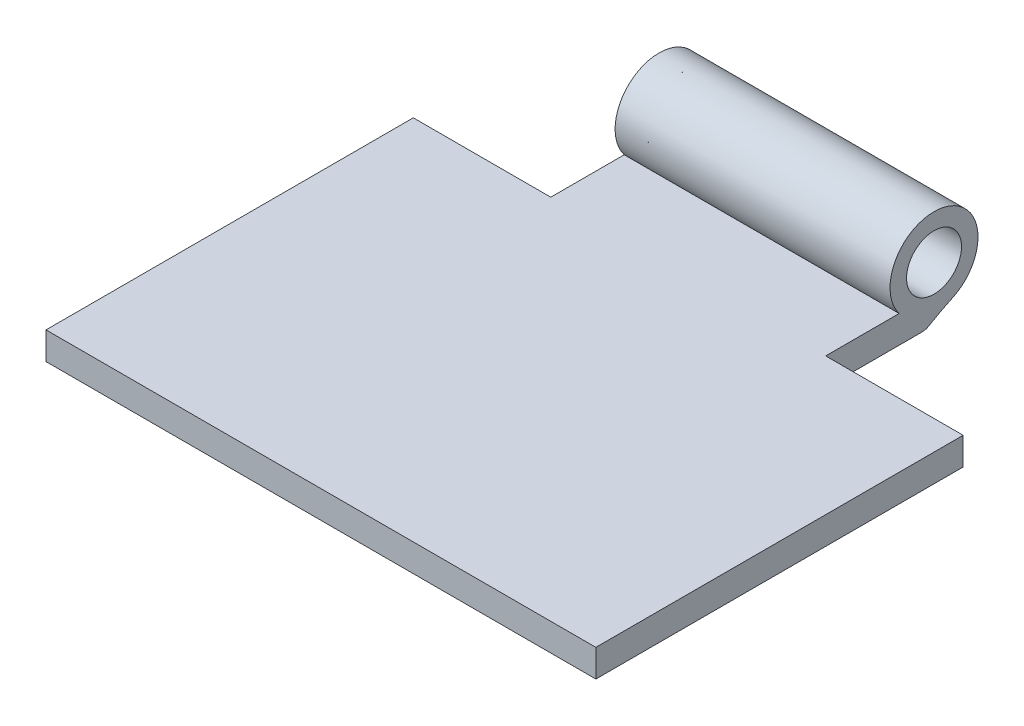
ISO-10303-21;
HEADER;
FILE_DESCRIPTION(('STEP AP214'),'2;1');
FILE_NAME('part.step','',(''),(''),'','','');
FILE_SCHEMA(('AUTOMOTIVE_DESIGN { 1 0 10303 214 1 1 1 1 }'));
ENDSEC;
DATA;
#1=APPLICATION_CONTEXT('core data for automotive mechanical design processes');
#2=APPLICATION_PROTOCOL_DEFINITION('international standard','automotive_design',2000,#1);
#3=PRODUCT_CONTEXT('',#1,'mechanical');
#4=PRODUCT('Part','Part','',(#3));
#5=PRODUCT_RELATED_PRODUCT_CATEGORY('part','',(#4));
#6=PRODUCT_DEFINITION_FORMATION('','',#4);
#7=PRODUCT_DEFINITION_CONTEXT('part definition',#1,'design');
#8=PRODUCT_DEFINITION('design','',#6,#7);
#9=PRODUCT_DEFINITION_SHAPE('','',#8);
#10=(LENGTH_UNIT() NAMED_UNIT(*) SI_UNIT(.MILLI.,.METRE.));
#11=(NAMED_UNIT(*) PLANE_ANGLE_UNIT() SI_UNIT($,.RADIAN.));
#12=(NAMED_UNIT(*) SI_UNIT($,.STERADIAN.) SOLID_ANGLE_UNIT());
#13=UNCERTAINTY_MEASURE_WITH_UNIT(LENGTH_MEASURE(1.E-05),#10,'distance_accuracy_value','');
#14=(GEOMETRIC_REPRESENTATION_CONTEXT(3) GLOBAL_UNCERTAINTY_ASSIGNED_CONTEXT((#13)) GLOBAL_UNIT_ASSIGNED_CONTEXT((#10,
#11,#12)) REPRESENTATION_CONTEXT('',''));
#15=CARTESIAN_POINT('',(0.,0.,0.));
#16=DIRECTION('',(0.,0.,1.));
#17=DIRECTION('',(1.,0.,0.));
#18=AXIS2_PLACEMENT_3D('',#15,#16,#17);
#19=CARTESIAN_POINT('',(0.,1.,0.));
#20=DIRECTION('',(0.,1.,0.));
#21=DIRECTION('',(0.,0.,1.));
#22=AXIS2_PLACEMENT_3D('',#19,#20,#21);
#23=PLANE('',#22);
#24=DIRECTION('',(0.,0.,1.));
#25=VECTOR('',#24,1.);
#26=CARTESIAN_POINT('',(-5.,1.,0.));
#27=LINE('',#26,#25);
#28=CARTESIAN_POINT('',(-5.,1.,-7.53132478332535));
#29=VERTEX_POINT('',#28);
#30=CARTESIAN_POINT('',(-5.,1.,-4.85985900820097));
#31=VERTEX_POINT('',#30);
#32=EDGE_CURVE('E134',#29,#31,#27,.T.);
#33=ORIENTED_EDGE('',*,*,#32,.T.);
#34=DIRECTION('',(-1.,0.,0.));
#35=VECTOR('',#34,1.);
#36=CARTESIAN_POINT('',(0.,1.,-4.85985900820097));
#37=LINE('',#36,#35);
#38=CARTESIAN_POINT('',(-10.,1.,-4.85985900820097));
#39=VERTEX_POINT('',#38);
#40=EDGE_CURVE('E114',#31,#39,#37,.T.);
#41=ORIENTED_EDGE('',*,*,#40,.T.);
#42=DIRECTION('',(0.,0.,1.));
#43=VECTOR('',#42,1.);
#44=CARTESIAN_POINT('',(-10.,1.,-8.5));
#45=LINE('',#44,#43);
#46=CARTESIAN_POINT('',(-10.,1.,8.5));
#47=VERTEX_POINT('',#46);
#48=EDGE_CURVE('E166',#39,#47,#45,.T.);
#49=ORIENTED_EDGE('',*,*,#48,.T.);
#50=DIRECTION('',(1.,0.,0.));
#51=VECTOR('',#50,1.);
#52=CARTESIAN_POINT('',(-10.,1.,8.5));
#53=LINE('',#52,#51);
#54=CARTESIAN_POINT('',(10.,1.,8.5));
#55=VERTEX_POINT('',#54);
#56=EDGE_CURVE('E169',#47,#55,#53,.T.);
#57=ORIENTED_EDGE('',*,*,#56,.T.);
#58=DIRECTION('',(0.,0.,-1.));
#59=VECTOR('',#58,1.);
#60=CARTESIAN_POINT('',(10.,1.,-8.5));
#61=LINE('',#60,#59);
#62=CARTESIAN_POINT('',(10.,1.,-4.85985900820097));
#63=VERTEX_POINT('',#62);
#64=EDGE_CURVE('E163',#55,#63,#61,.T.);
#65=ORIENTED_EDGE('',*,*,#64,.T.);
#66=DIRECTION('',(-1.,0.,0.));
#67=VECTOR('',#66,1.);
#68=CARTESIAN_POINT('',(0.,1.,-4.85985900820097));
#69=LINE('',#68,#67);
#70=CARTESIAN_POINT('',(5.,1.,-4.85985900820097));
#71=VERTEX_POINT('',#70);
#72=EDGE_CURVE('E157',#63,#71,#69,.T.);
#73=ORIENTED_EDGE('',*,*,#72,.T.);
#74=DIRECTION('',(0.,0.,-1.));
#75=VECTOR('',#74,1.);
#76=CARTESIAN_POINT('',(5.00000000000002,1.,0.));
#77=LINE('',#76,#75);
#78=CARTESIAN_POINT('',(4.99999999999999,1.,-7.53132478332535));
#79=VERTEX_POINT('',#78);
#80=EDGE_CURVE('E151',#71,#79,#77,.T.);
#81=ORIENTED_EDGE('',*,*,#80,.T.);
#82=DIRECTION('',(1.,0.,0.));
#83=VECTOR('',#82,1.);
#84=CARTESIAN_POINT('',(-10.,1.,-7.53132478332535));
#85=LINE('',#84,#83);
#86=EDGE_CURVE('E181',#29,#79,#85,.T.);
#87=ORIENTED_EDGE('',*,*,#86,.F.);
#88=EDGE_LOOP('',(#33,#41,#49,#57,#65,#73,#81,#87));
#89=FACE_BOUND('',#88,.T.);
#90=ADVANCED_FACE('F33',(#89),#23,.T.);
#91=CARTESIAN_POINT('',(0.,0.,0.));
#92=DIRECTION('',(0.,1.,0.));
#93=DIRECTION('',(0.,0.,1.));
#94=AXIS2_PLACEMENT_3D('',#91,#92,#93);
#95=PLANE('',#94);
#96=DIRECTION('',(1.,0.,0.));
#97=VECTOR('',#96,1.);
#98=CARTESIAN_POINT('',(-5.,0.,-4.85985900820097));
#99=LINE('',#98,#97);
#100=CARTESIAN_POINT('',(-10.,0.,-4.85985900820097));
#101=VERTEX_POINT('',#100);
#102=CARTESIAN_POINT('',(-5.,0.,-4.85985900820097));
#103=VERTEX_POINT('',#102);
#104=EDGE_CURVE('E48',#101,#103,#99,.T.);
#105=ORIENTED_EDGE('',*,*,#104,.T.);
#106=DIRECTION('',(0.,0.,-1.));
#107=VECTOR('',#106,1.);
#108=CARTESIAN_POINT('',(-5.,0.,-4.85985900820097));
#109=LINE('',#108,#107);
#110=CARTESIAN_POINT('',(-5.,0.,-8.361263217668));
#111=VERTEX_POINT('',#110);
#112=EDGE_CURVE('E117',#103,#111,#109,.T.);
#113=ORIENTED_EDGE('',*,*,#112,.T.);
#114=DIRECTION('',(-1.,0.,0.));
#115=VECTOR('',#114,1.);
#116=CARTESIAN_POINT('',(0.,0.,-8.361263217668));
#117=LINE('',#116,#115);
#118=CARTESIAN_POINT('',(4.99999999999998,0.,-8.361263217668));
#119=VERTEX_POINT('',#118);
#120=EDGE_CURVE('E56',#111,#119,#117,.F.);
#121=ORIENTED_EDGE('',*,*,#120,.T.);
#122=DIRECTION('',(0.,0.,1.));
#123=VECTOR('',#122,1.);
#124=CARTESIAN_POINT('',(5.,0.,-4.85985900820097));
#125=LINE('',#124,#123);
#126=CARTESIAN_POINT('',(5.,0.,-4.85985900820097));
#127=VERTEX_POINT('',#126);
#128=EDGE_CURVE('E142',#119,#127,#125,.T.);
#129=ORIENTED_EDGE('',*,*,#128,.T.);
#130=DIRECTION('',(1.,0.,0.));
#131=VECTOR('',#130,1.);
#132=CARTESIAN_POINT('',(5.,0.,-4.85985900820097));
#133=LINE('',#132,#131);
#134=CARTESIAN_POINT('',(10.,0.,-4.85985900820097));
#135=VERTEX_POINT('',#134);
#136=EDGE_CURVE('E139',#127,#135,#133,.T.);
#137=ORIENTED_EDGE('',*,*,#136,.T.);
#138=DIRECTION('',(0.,0.,-1.));
#139=VECTOR('',#138,1.);
#140=CARTESIAN_POINT('',(10.,0.,-8.5));
#141=LINE('',#140,#139);
#142=CARTESIAN_POINT('',(10.,0.,8.5));
#143=VERTEX_POINT('',#142);
#144=EDGE_CURVE('E162',#143,#135,#141,.T.);
#145=ORIENTED_EDGE('',*,*,#144,.F.);
#146=DIRECTION('',(1.,0.,0.));
#147=VECTOR('',#146,1.);
#148=CARTESIAN_POINT('',(-10.,0.,8.5));
#149=LINE('',#148,#147);
#150=CARTESIAN_POINT('',(-10.,0.,8.5));
#151=VERTEX_POINT('',#150);
#152=EDGE_CURVE('E167',#151,#143,#149,.T.);
#153=ORIENTED_EDGE('',*,*,#152,.F.);
#154=DIRECTION('',(0.,0.,1.));
#155=VECTOR('',#154,1.);
#156=CARTESIAN_POINT('',(-10.,0.,-8.5));
#157=LINE('',#156,#155);
#158=EDGE_CURVE('E125',#101,#151,#157,.T.);
#159=ORIENTED_EDGE('',*,*,#158,.F.);
#160=EDGE_LOOP('',(#105,#113,#121,#129,#137,#145,#153,#159));
#161=FACE_BOUND('',#160,.T.);
#162=ADVANCED_FACE('F123',(#161),#95,.F.);
#163=CARTESIAN_POINT('',(-10.,1.97441698705141,-8.80038409452623));
#164=DIRECTION('',(1.,0.,0.));
#165=DIRECTION('',(0.,0.,-1.));
#166=AXIS2_PLACEMENT_3D('',#163,#164,#165);
#167=CYLINDRICAL_SURFACE('',#166,1.6);
#168=DIRECTION('',(1.,0.,0.));
#169=VECTOR('',#168,1.);
#170=CARTESIAN_POINT('',(-10.,0.524878328822285,-9.47775967594269));
#171=LINE('',#170,#169);
#172=CARTESIAN_POINT('',(4.99999999999999,0.524878328822285,-9.47775967594269));
#173=VERTEX_POINT('',#172);
#174=CARTESIAN_POINT('',(-5.,0.524878328822285,-9.47775967594269));
#175=VERTEX_POINT('',#174);
#176=EDGE_CURVE('E183',#173,#175,#171,.F.);
#177=ORIENTED_EDGE('',*,*,#176,.T.);
#178=CARTESIAN_POINT('',(-5.,1.97441698705141,-8.80038409452623));
#179=DIRECTION('',(-1.,0.,0.));
#180=DIRECTION('',(0.,0.,1.));
#181=AXIS2_PLACEMENT_3D('',#178,#179,#180);
#182=CIRCLE('',#181,1.6);
#183=EDGE_CURVE('E131',#175,#29,#182,.F.);
#184=ORIENTED_EDGE('',*,*,#183,.T.);
#185=ORIENTED_EDGE('',*,*,#86,.T.);
#186=CARTESIAN_POINT('',(4.99999999999999,1.97441698705141,-8.80038409452623));
#187=DIRECTION('',(1.,0.,0.));
#188=DIRECTION('',(0.,0.,-1.));
#189=AXIS2_PLACEMENT_3D('',#186,#187,#188);
#190=CIRCLE('',#189,1.6);
#191=EDGE_CURVE('E149',#79,#173,#190,.F.);
#192=ORIENTED_EDGE('',*,*,#191,.T.);
#193=EDGE_LOOP('',(#177,#184,#185,#192));
#194=FACE_BOUND('',#193,.T.);
#195=ADVANCED_FACE('F223',(#194),#167,.T.);
#196=CARTESIAN_POINT('',(-10.,1.97441698705141,-8.80038409452623));
#197=DIRECTION('',(1.,0.,0.));
#198=DIRECTION('',(0.,0.,-1.));
#199=AXIS2_PLACEMENT_3D('',#196,#197,#198);
#200=CYLINDRICAL_SURFACE('',#199,1.);
#201=CARTESIAN_POINT('',(4.99999999999999,1.97441698705141,-8.80038409452623));
#202=DIRECTION('',(1.,0.,0.));
#203=DIRECTION('',(0.,0.,-1.));
#204=AXIS2_PLACEMENT_3D('',#201,#202,#203);
#205=CIRCLE('',#204,1.);
#206=CARTESIAN_POINT('',(4.99999999999999,1.97441698705141,-9.80038409452623));
#207=VERTEX_POINT('',#206);
#208=EDGE_CURVE('E154',#207,#207,#205,.F.);
#209=ORIENTED_EDGE('',*,*,#208,.F.);
#210=EDGE_LOOP('',(#209));
#211=FACE_BOUND('',#210,.T.);
#212=CARTESIAN_POINT('',(-5.,1.97441698705141,-8.80038409452623));
#213=DIRECTION('',(-1.,0.,0.));
#214=DIRECTION('',(0.,0.,1.));
#215=AXIS2_PLACEMENT_3D('',#212,#213,#214);
#216=CIRCLE('',#215,1.);
#217=CARTESIAN_POINT('',(-5.,1.97441698705141,-7.80038409452623));
#218=VERTEX_POINT('',#217);
#219=EDGE_CURVE('E136',#218,#218,#216,.F.);
#220=ORIENTED_EDGE('',*,*,#219,.F.);
#221=EDGE_LOOP('',(#220));
#222=FACE_BOUND('',#221,.T.);
#223=ADVANCED_FACE('F225',(#211,#222),#200,.F.);
#224=CARTESIAN_POINT('',(-10.,-8.53473828510978,-13.7113570597956));
#225=DIRECTION('',(-1.,0.,0.));
#226=DIRECTION('',(0.,0.,1.));
#227=AXIS2_PLACEMENT_3D('',#224,#225,#226);
#228=CYLINDRICAL_SURFACE('',#227,10.);
#229=CARTESIAN_POINT('',(-5.,-8.53473828510978,-13.7113570597956));
#230=DIRECTION('',(-1.,0.,0.));
#231=DIRECTION('',(0.,0.,1.));
#232=AXIS2_PLACEMENT_3D('',#229,#230,#231);
#233=CIRCLE('',#232,10.);
#234=CARTESIAN_POINT('',(-5.,0.0697743673757254,-8.61602959110265));
#235=VERTEX_POINT('',#234);
#236=EDGE_CURVE('E129',#175,#235,#233,.F.);
#237=ORIENTED_EDGE('',*,*,#236,.F.);
#238=ORIENTED_EDGE('',*,*,#176,.F.);
#239=CARTESIAN_POINT('',(4.99999999999997,-8.53473828510978,-13.7113570597956));
#240=DIRECTION('',(1.,0.,0.));
#241=DIRECTION('',(0.,0.,-1.));
#242=AXIS2_PLACEMENT_3D('',#239,#240,#241);
#243=CIRCLE('',#242,10.);
#244=CARTESIAN_POINT('',(4.99999999999999,0.0697743673757254,-8.61602959110265));
#245=VERTEX_POINT('',#244);
#246=EDGE_CURVE('E146',#245,#173,#243,.F.);
#247=ORIENTED_EDGE('',*,*,#246,.F.);
#248=DIRECTION('',(-1.,0.,0.));
#249=VECTOR('',#248,1.);
#250=CARTESIAN_POINT('',(-10.,0.0697743673757252,-8.61602959110265));
#251=LINE('',#250,#249);
#252=EDGE_CURVE('E186',#245,#235,#251,.T.);
#253=ORIENTED_EDGE('',*,*,#252,.T.);
#254=EDGE_LOOP('',(#237,#238,#247,#253));
#255=FACE_BOUND('',#254,.T.);
#256=ADVANCED_FACE('F219',(#255),#228,.F.);
#257=CARTESIAN_POINT('',(-10.,0.5,-8.361263217668));
#258=DIRECTION('',(-1.,0.,0.));
#259=DIRECTION('',(0.,0.,1.));
#260=AXIS2_PLACEMENT_3D('',#257,#258,#259);
#261=CYLINDRICAL_SURFACE('',#260,0.5);
#262=ORIENTED_EDGE('',*,*,#120,.F.);
#263=CARTESIAN_POINT('',(-5.,0.5,-8.361263217668));
#264=DIRECTION('',(-1.,0.,0.));
#265=DIRECTION('',(0.,0.,1.));
#266=AXIS2_PLACEMENT_3D('',#263,#264,#265);
#267=CIRCLE('',#266,0.5);
#268=EDGE_CURVE('E11',#111,#235,#267,.F.);
#269=ORIENTED_EDGE('',*,*,#268,.T.);
#270=ORIENTED_EDGE('',*,*,#252,.F.);
#271=CARTESIAN_POINT('',(4.99999999999999,0.5,-8.361263217668));
#272=DIRECTION('',(1.,0.,0.));
#273=DIRECTION('',(0.,0.,-1.));
#274=AXIS2_PLACEMENT_3D('',#271,#272,#273);
#275=CIRCLE('',#274,0.5);
#276=EDGE_CURVE('E190',#245,#119,#275,.F.);
#277=ORIENTED_EDGE('',*,*,#276,.T.);
#278=EDGE_LOOP('',(#262,#269,#270,#277));
#279=FACE_BOUND('',#278,.T.);
#280=ADVANCED_FACE('F35',(#279),#261,.T.);
#281=CARTESIAN_POINT('',(-10.,1.,-8.5));
#282=DIRECTION('',(1.,0.,0.));
#283=DIRECTION('',(0.,0.,-1.));
#284=AXIS2_PLACEMENT_3D('',#281,#282,#283);
#285=PLANE('',#284);
#286=DIRECTION('',(0.,1.,0.));
#287=VECTOR('',#286,1.);
#288=CARTESIAN_POINT('',(-10.,1.,-4.85985900820097));
#289=LINE('',#288,#287);
#290=EDGE_CURVE('E41',#101,#39,#289,.T.);
#291=ORIENTED_EDGE('',*,*,#290,.F.);
#292=ORIENTED_EDGE('',*,*,#158,.T.);
#293=DIRECTION('',(0.,-1.,0.));
#294=VECTOR('',#293,1.);
#295=CARTESIAN_POINT('',(-10.,1.,8.5));
#296=LINE('',#295,#294);
#297=EDGE_CURVE('E178',#47,#151,#296,.T.);
#298=ORIENTED_EDGE('',*,*,#297,.F.);
#299=ORIENTED_EDGE('',*,*,#48,.F.);
#300=EDGE_LOOP('',(#291,#292,#298,#299));
#301=FACE_BOUND('',#300,.T.);
#302=ADVANCED_FACE('F197',(#301),#285,.F.);
#303=CARTESIAN_POINT('',(10.,1.,-8.5));
#304=DIRECTION('',(-1.,0.,0.));
#305=DIRECTION('',(0.,0.,1.));
#306=AXIS2_PLACEMENT_3D('',#303,#304,#305);
#307=PLANE('',#306);
#308=DIRECTION('',(0.,-1.,0.));
#309=VECTOR('',#308,1.);
#310=CARTESIAN_POINT('',(10.,1.,-4.85985900820097));
#311=LINE('',#310,#309);
#312=EDGE_CURVE('E160',#63,#135,#311,.T.);
#313=ORIENTED_EDGE('',*,*,#312,.F.);
#314=ORIENTED_EDGE('',*,*,#64,.F.);
#315=DIRECTION('',(0.,-1.,0.));
#316=VECTOR('',#315,1.);
#317=CARTESIAN_POINT('',(10.,1.,8.5));
#318=LINE('',#317,#316);
#319=EDGE_CURVE('E171',#55,#143,#318,.T.);
#320=ORIENTED_EDGE('',*,*,#319,.T.);
#321=ORIENTED_EDGE('',*,*,#144,.T.);
#322=EDGE_LOOP('',(#313,#314,#320,#321));
#323=FACE_BOUND('',#322,.T.);
#324=ADVANCED_FACE('F205',(#323),#307,.F.);
#325=CARTESIAN_POINT('',(-10.,1.,8.5));
#326=DIRECTION('',(0.,0.,-1.));
#327=DIRECTION('',(-1.,0.,0.));
#328=AXIS2_PLACEMENT_3D('',#325,#326,#327);
#329=PLANE('',#328);
#330=ORIENTED_EDGE('',*,*,#152,.T.);
#331=ORIENTED_EDGE('',*,*,#319,.F.);
#332=ORIENTED_EDGE('',*,*,#56,.F.);
#333=ORIENTED_EDGE('',*,*,#297,.T.);
#334=EDGE_LOOP('',(#330,#331,#332,#333));
#335=FACE_BOUND('',#334,.T.);
#336=ADVANCED_FACE('F201',(#335),#329,.F.);
#337=CARTESIAN_POINT('',(5.,3.57441698705142,-4.85985900820097));
#338=DIRECTION('',(0.,0.,-1.));
#339=DIRECTION('',(-1.,0.,0.));
#340=AXIS2_PLACEMENT_3D('',#337,#338,#339);
#341=PLANE('',#340);
#342=ORIENTED_EDGE('',*,*,#312,.T.);
#343=ORIENTED_EDGE('',*,*,#136,.F.);
#344=DIRECTION('',(0.,-1.,0.));
#345=VECTOR('',#344,1.);
#346=CARTESIAN_POINT('',(5.,3.57441698705142,-4.85985900820097));
#347=LINE('',#346,#345);
#348=EDGE_CURVE('E144',#71,#127,#347,.T.);
#349=ORIENTED_EDGE('',*,*,#348,.F.);
#350=ORIENTED_EDGE('',*,*,#72,.F.);
#351=EDGE_LOOP('',(#342,#343,#349,#350));
#352=FACE_BOUND('',#351,.T.);
#353=ADVANCED_FACE('F209',(#352),#341,.T.);
#354=CARTESIAN_POINT('',(5.,3.57441698705142,-4.85985900820097));
#355=DIRECTION('',(1.,0.,0.));
#356=DIRECTION('',(0.,0.,-1.));
#357=AXIS2_PLACEMENT_3D('',#354,#355,#356);
#358=PLANE('',#357);
#359=ORIENTED_EDGE('',*,*,#348,.T.);
#360=ORIENTED_EDGE('',*,*,#128,.F.);
#361=ORIENTED_EDGE('',*,*,#276,.F.);
#362=ORIENTED_EDGE('',*,*,#246,.T.);
#363=ORIENTED_EDGE('',*,*,#191,.F.);
#364=ORIENTED_EDGE('',*,*,#80,.F.);
#365=EDGE_LOOP('',(#359,#360,#361,#362,#363,#364));
#366=FACE_BOUND('',#365,.T.);
#367=ORIENTED_EDGE('',*,*,#208,.T.);
#368=EDGE_LOOP('',(#367));
#369=FACE_BOUND('',#368,.T.);
#370=ADVANCED_FACE('F212',(#366,#369),#358,.T.);
#371=CARTESIAN_POINT('',(-5.,3.57441698705142,-4.85985900820097));
#372=DIRECTION('',(-1.,0.,0.));
#373=DIRECTION('',(0.,0.,1.));
#374=AXIS2_PLACEMENT_3D('',#371,#372,#373);
#375=PLANE('',#374);
#376=ORIENTED_EDGE('',*,*,#183,.F.);
#377=ORIENTED_EDGE('',*,*,#236,.T.);
#378=ORIENTED_EDGE('',*,*,#268,.F.);
#379=ORIENTED_EDGE('',*,*,#112,.F.);
#380=DIRECTION('',(0.,-1.,0.));
#381=VECTOR('',#380,1.);
#382=CARTESIAN_POINT('',(-5.,3.57441698705142,-4.85985900820097));
#383=LINE('',#382,#381);
#384=EDGE_CURVE('E110',#31,#103,#383,.T.);
#385=ORIENTED_EDGE('',*,*,#384,.F.);
#386=ORIENTED_EDGE('',*,*,#32,.F.);
#387=EDGE_LOOP('',(#376,#377,#378,#379,#385,#386));
#388=FACE_BOUND('',#387,.T.);
#389=ORIENTED_EDGE('',*,*,#219,.T.);
#390=EDGE_LOOP('',(#389));
#391=FACE_BOUND('',#390,.T.);
#392=ADVANCED_FACE('F119',(#388,#391),#375,.T.);
#393=CARTESIAN_POINT('',(-5.,3.57441698705142,-4.85985900820097));
#394=DIRECTION('',(0.,0.,-1.));
#395=DIRECTION('',(-1.,0.,0.));
#396=AXIS2_PLACEMENT_3D('',#393,#394,#395);
#397=PLANE('',#396);
#398=ORIENTED_EDGE('',*,*,#384,.T.);
#399=ORIENTED_EDGE('',*,*,#104,.F.);
#400=ORIENTED_EDGE('',*,*,#290,.T.);
#401=ORIENTED_EDGE('',*,*,#40,.F.);
#402=EDGE_LOOP('',(#398,#399,#400,#401));
#403=FACE_BOUND('',#402,.T.);
#404=ADVANCED_FACE('F112',(#403),#397,.T.);
#405=CLOSED_SHELL('',(#90,#162,#195,#223,#256,#280,#302,#324,#336,#353,#370,#392,#404));
#406=MANIFOLD_SOLID_BREP('B2',#405);
#407=ADVANCED_BREP_SHAPE_REPRESENTATION('',(#18,#406),#14);
#408=SHAPE_DEFINITION_REPRESENTATION(#9,#407);
ENDSEC;
END-ISO-10303-21;
